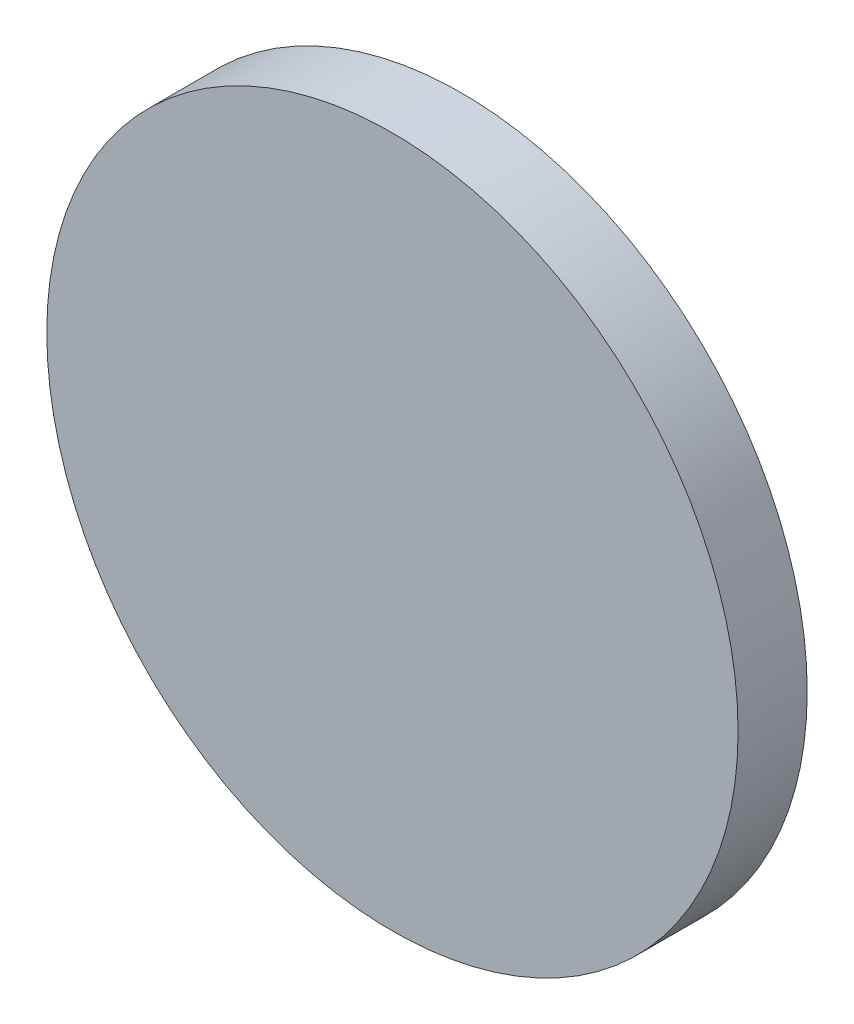
ISO-10303-21;
HEADER;
FILE_DESCRIPTION(('STEP AP214'),'2;1');
FILE_NAME('part.step','',(''),(''),'','','');
FILE_SCHEMA(('AUTOMOTIVE_DESIGN { 1 0 10303 214 1 1 1 1 }'));
ENDSEC;
DATA;
#1=APPLICATION_CONTEXT('core data for automotive mechanical design processes');
#2=APPLICATION_PROTOCOL_DEFINITION('international standard','automotive_design',2000,#1);
#3=PRODUCT_CONTEXT('',#1,'mechanical');
#4=PRODUCT('Part','Part','',(#3));
#5=PRODUCT_RELATED_PRODUCT_CATEGORY('part','',(#4));
#6=PRODUCT_DEFINITION_FORMATION('','',#4);
#7=PRODUCT_DEFINITION_CONTEXT('part definition',#1,'design');
#8=PRODUCT_DEFINITION('design','',#6,#7);
#9=PRODUCT_DEFINITION_SHAPE('','',#8);
#10=(LENGTH_UNIT() NAMED_UNIT(*) SI_UNIT(.MILLI.,.METRE.));
#11=(NAMED_UNIT(*) PLANE_ANGLE_UNIT() SI_UNIT($,.RADIAN.));
#12=(NAMED_UNIT(*) SI_UNIT($,.STERADIAN.) SOLID_ANGLE_UNIT());
#13=UNCERTAINTY_MEASURE_WITH_UNIT(LENGTH_MEASURE(1.E-05),#10,'distance_accuracy_value','');
#14=(GEOMETRIC_REPRESENTATION_CONTEXT(3) GLOBAL_UNCERTAINTY_ASSIGNED_CONTEXT((#13)) GLOBAL_UNIT_ASSIGNED_CONTEXT((#10,
#11,#12)) REPRESENTATION_CONTEXT('',''));
#15=CARTESIAN_POINT('',(0.,0.,0.));
#16=DIRECTION('',(0.,0.,1.));
#17=DIRECTION('',(1.,0.,0.));
#18=AXIS2_PLACEMENT_3D('',#15,#16,#17);
#19=CARTESIAN_POINT('',(0.,0.,10.));
#20=DIRECTION('',(0.,0.,-1.));
#21=DIRECTION('',(-1.,0.,0.));
#22=AXIS2_PLACEMENT_3D('',#19,#20,#21);
#23=CYLINDRICAL_SURFACE('',#22,50.);
#24=CARTESIAN_POINT('',(0.,0.,10.));
#25=DIRECTION('',(0.,0.,1.));
#26=DIRECTION('',(1.,0.,0.));
#27=AXIS2_PLACEMENT_3D('',#24,#25,#26);
#28=CIRCLE('',#27,50.);
#29=CARTESIAN_POINT('',(50.,0.,10.));
#30=VERTEX_POINT('',#29);
#31=EDGE_CURVE('E10',#30,#30,#28,.T.);
#32=ORIENTED_EDGE('',*,*,#31,.F.);
#33=EDGE_LOOP('',(#32));
#34=FACE_BOUND('',#33,.T.);
#35=CARTESIAN_POINT('',(0.,0.,0.));
#36=DIRECTION('',(0.,0.,1.));
#37=DIRECTION('',(1.,0.,0.));
#38=AXIS2_PLACEMENT_3D('',#35,#36,#37);
#39=CIRCLE('',#38,50.);
#40=CARTESIAN_POINT('',(50.,0.,0.));
#41=VERTEX_POINT('',#40);
#42=EDGE_CURVE('E40',#41,#41,#39,.T.);
#43=ORIENTED_EDGE('',*,*,#42,.T.);
#44=EDGE_LOOP('',(#43));
#45=FACE_BOUND('',#44,.T.);
#46=ADVANCED_FACE('F37',(#34,#45),#23,.T.);
#47=CARTESIAN_POINT('',(0.,0.,10.));
#48=DIRECTION('',(0.,0.,1.));
#49=DIRECTION('',(1.,0.,0.));
#50=AXIS2_PLACEMENT_3D('',#47,#48,#49);
#51=PLANE('',#50);
#52=ORIENTED_EDGE('',*,*,#31,.T.);
#53=EDGE_LOOP('',(#52));
#54=FACE_BOUND('',#53,.T.);
#55=ADVANCED_FACE('F54',(#54),#51,.T.);
#56=CARTESIAN_POINT('',(0.,0.,0.));
#57=DIRECTION('',(0.,0.,1.));
#58=DIRECTION('',(1.,0.,0.));
#59=AXIS2_PLACEMENT_3D('',#56,#57,#58);
#60=PLANE('',#59);
#61=ORIENTED_EDGE('',*,*,#42,.F.);
#62=EDGE_LOOP('',(#61));
#63=FACE_BOUND('',#62,.T.);
#64=ADVANCED_FACE('F52',(#63),#60,.F.);
#65=CLOSED_SHELL('',(#46,#55,#64));
#66=MANIFOLD_SOLID_BREP('B2',#65);
#67=ADVANCED_BREP_SHAPE_REPRESENTATION('',(#18,#66),#14);
#68=SHAPE_DEFINITION_REPRESENTATION(#9,#67);
ENDSEC;
END-ISO-10303-21;
